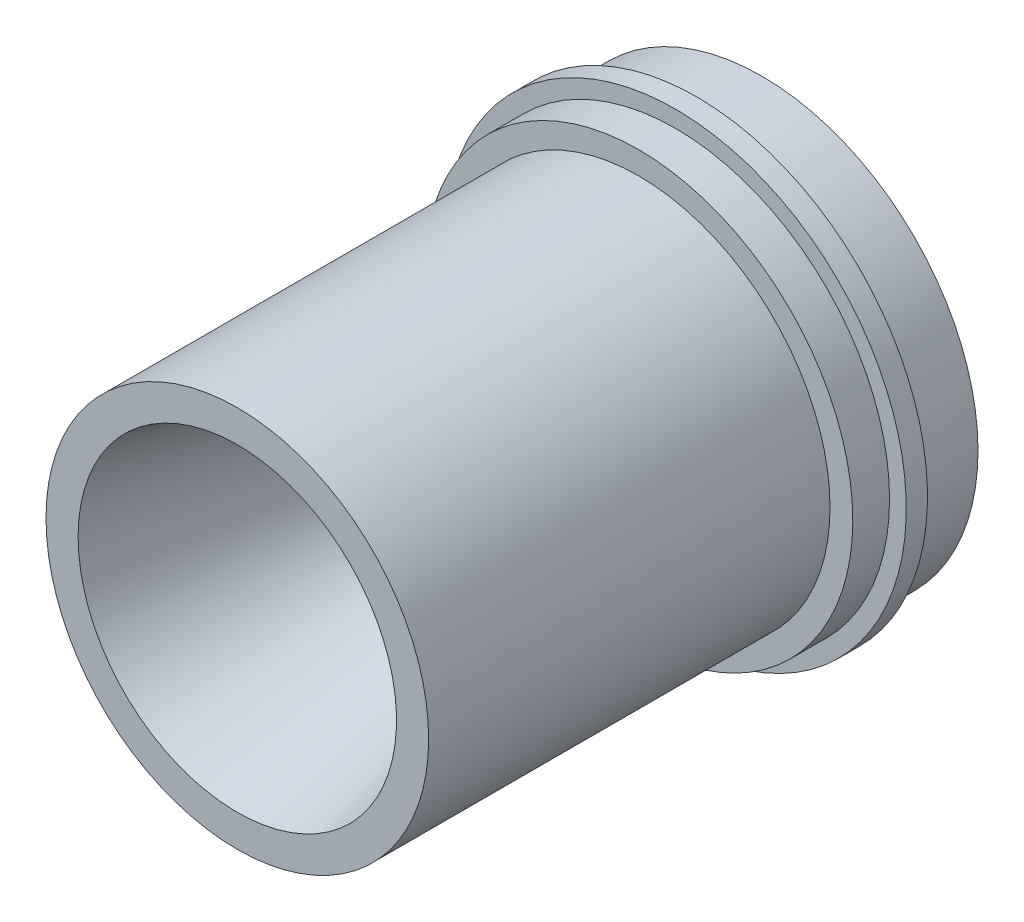
ISO-10303-21;
HEADER;
FILE_DESCRIPTION(('STEP AP214'),'2;1');
FILE_NAME('part.step','',(''),(''),'','','');
FILE_SCHEMA(('AUTOMOTIVE_DESIGN { 1 0 10303 214 1 1 1 1 }'));
ENDSEC;
DATA;
#1=APPLICATION_CONTEXT('core data for automotive mechanical design processes');
#2=APPLICATION_PROTOCOL_DEFINITION('international standard','automotive_design',2000,#1);
#3=PRODUCT_CONTEXT('',#1,'mechanical');
#4=PRODUCT('Part','Part','',(#3));
#5=PRODUCT_RELATED_PRODUCT_CATEGORY('part','',(#4));
#6=PRODUCT_DEFINITION_FORMATION('','',#4);
#7=PRODUCT_DEFINITION_CONTEXT('part definition',#1,'design');
#8=PRODUCT_DEFINITION('design','',#6,#7);
#9=PRODUCT_DEFINITION_SHAPE('','',#8);
#10=(LENGTH_UNIT() NAMED_UNIT(*) SI_UNIT(.MILLI.,.METRE.));
#11=(NAMED_UNIT(*) PLANE_ANGLE_UNIT() SI_UNIT($,.RADIAN.));
#12=(NAMED_UNIT(*) SI_UNIT($,.STERADIAN.) SOLID_ANGLE_UNIT());
#13=UNCERTAINTY_MEASURE_WITH_UNIT(LENGTH_MEASURE(1.E-05),#10,'distance_accuracy_value','');
#14=(GEOMETRIC_REPRESENTATION_CONTEXT(3) GLOBAL_UNCERTAINTY_ASSIGNED_CONTEXT((#13)) GLOBAL_UNIT_ASSIGNED_CONTEXT((#10,
#11,#12)) REPRESENTATION_CONTEXT('',''));
#15=CARTESIAN_POINT('',(0.,0.,0.));
#16=DIRECTION('',(0.,0.,1.));
#17=DIRECTION('',(1.,0.,0.));
#18=AXIS2_PLACEMENT_3D('',#15,#16,#17);
#19=CARTESIAN_POINT('',(9.779,0.,0.));
#20=CARTESIAN_POINT('',(14.4166614893684,0.,-10.527989379748));
#21=CARTESIAN_POINT('',(26.83,0.,-9.72));
#22=B_SPLINE_CURVE_WITH_KNOTS('',2,(#19,#20,#21),.UNSPECIFIED.,.F.,.F.,(3,3),(0.,1.),.UNSPECIFIED.);
#23=CARTESIAN_POINT('',(0.,0.,0.));
#24=DIRECTION('',(0.,0.,-1.));
#25=AXIS1_PLACEMENT('',#23,#24);
#26=SURFACE_OF_REVOLUTION('',#22,#25);
#27=CARTESIAN_POINT('',(0.,0.,-9.72));
#28=DIRECTION('',(0.,0.,-1.));
#29=DIRECTION('',(-1.,0.,0.));
#30=AXIS2_PLACEMENT_3D('',#27,#28,#29);
#31=CIRCLE('',#30,26.83);
#32=CARTESIAN_POINT('',(-26.83,0.,-9.72));
#33=VERTEX_POINT('',#32);
#34=EDGE_CURVE('E97',#33,#33,#31,.T.);
#35=ORIENTED_EDGE('',*,*,#34,.T.);
#36=EDGE_LOOP('',(#35));
#37=FACE_BOUND('',#36,.T.);
#38=CARTESIAN_POINT('',(0.,0.,0.));
#39=DIRECTION('',(0.,0.,-1.));
#40=DIRECTION('',(-1.,0.,0.));
#41=AXIS2_PLACEMENT_3D('',#38,#39,#40);
#42=CIRCLE('',#41,9.779);
#43=CARTESIAN_POINT('',(-9.779,0.,0.));
#44=VERTEX_POINT('',#43);
#45=EDGE_CURVE('E10',#44,#44,#42,.T.);
#46=ORIENTED_EDGE('',*,*,#45,.F.);
#47=EDGE_LOOP('',(#46));
#48=FACE_BOUND('',#47,.T.);
#49=ADVANCED_FACE('F45',(#37,#48),#26,.F.);
#50=CARTESIAN_POINT('',(0.,0.,0.));
#51=DIRECTION('',(0.,0.,-1.));
#52=DIRECTION('',(-1.,0.,0.));
#53=AXIS2_PLACEMENT_3D('',#50,#51,#52);
#54=CYLINDRICAL_SURFACE('',#53,9.779);
#55=ORIENTED_EDGE('',*,*,#45,.T.);
#56=EDGE_LOOP('',(#55));
#57=FACE_BOUND('',#56,.T.);
#58=CARTESIAN_POINT('',(0.,0.,13.6226));
#59=DIRECTION('',(0.,0.,-1.));
#60=DIRECTION('',(-1.,0.,0.));
#61=AXIS2_PLACEMENT_3D('',#58,#59,#60);
#62=CIRCLE('',#61,9.779);
#63=CARTESIAN_POINT('',(-9.779,0.,13.6226));
#64=VERTEX_POINT('',#63);
#65=EDGE_CURVE('E53',#64,#64,#62,.T.);
#66=ORIENTED_EDGE('',*,*,#65,.F.);
#67=EDGE_LOOP('',(#66));
#68=FACE_BOUND('',#67,.T.);
#69=ADVANCED_FACE('F140',(#57,#68),#54,.F.);
#70=CARTESIAN_POINT('',(0.,0.,13.6226));
#71=DIRECTION('',(0.,0.,1.));
#72=DIRECTION('',(1.,0.,0.));
#73=AXIS2_PLACEMENT_3D('',#70,#71,#72);
#74=CONICAL_SURFACE('',#73,9.779,0.249402799409452);
#75=CARTESIAN_POINT('',(0.,0.,68.670406433824));
#76=DIRECTION('',(0.,0.,-1.));
#77=DIRECTION('',(-1.,0.,0.));
#78=AXIS2_PLACEMENT_3D('',#75,#76,#77);
#79=CIRCLE('',#78,23.8);
#80=CARTESIAN_POINT('',(-23.8,0.,68.670406433824));
#81=VERTEX_POINT('',#80);
#82=EDGE_CURVE('E58',#81,#81,#79,.T.);
#83=ORIENTED_EDGE('',*,*,#82,.F.);
#84=EDGE_LOOP('',(#83));
#85=FACE_BOUND('',#84,.T.);
#86=ORIENTED_EDGE('',*,*,#65,.T.);
#87=EDGE_LOOP('',(#86));
#88=FACE_BOUND('',#87,.T.);
#89=ADVANCED_FACE('F144',(#85,#88),#74,.F.);
#90=CARTESIAN_POINT('',(0.,0.,68.670406433824));
#91=DIRECTION('',(0.,0.,1.));
#92=DIRECTION('',(1.,0.,0.));
#93=AXIS2_PLACEMENT_3D('',#90,#91,#92);
#94=PLANE('',#93);
#95=ORIENTED_EDGE('',*,*,#82,.T.);
#96=EDGE_LOOP('',(#95));
#97=FACE_BOUND('',#96,.T.);
#98=CARTESIAN_POINT('',(0.,0.,68.670406433824));
#99=DIRECTION('',(0.,0.,-1.));
#100=DIRECTION('',(-1.,0.,0.));
#101=AXIS2_PLACEMENT_3D('',#98,#99,#100);
#102=CIRCLE('',#101,28.6);
#103=CARTESIAN_POINT('',(-28.6,0.,68.670406433824));
#104=VERTEX_POINT('',#103);
#105=EDGE_CURVE('E63',#104,#104,#102,.T.);
#106=ORIENTED_EDGE('',*,*,#105,.F.);
#107=EDGE_LOOP('',(#106));
#108=FACE_BOUND('',#107,.T.);
#109=ADVANCED_FACE('F148',(#97,#108),#94,.T.);
#110=CARTESIAN_POINT('',(0.,0.,0.));
#111=DIRECTION('',(0.,0.,-1.));
#112=DIRECTION('',(-1.,0.,0.));
#113=AXIS2_PLACEMENT_3D('',#110,#111,#112);
#114=CYLINDRICAL_SURFACE('',#113,28.6);
#115=ORIENTED_EDGE('',*,*,#105,.T.);
#116=EDGE_LOOP('',(#115));
#117=FACE_BOUND('',#116,.T.);
#118=CARTESIAN_POINT('',(0.,0.,8.67040643382401));
#119=DIRECTION('',(0.,0.,-1.));
#120=DIRECTION('',(-1.,0.,0.));
#121=AXIS2_PLACEMENT_3D('',#118,#119,#120);
#122=CIRCLE('',#121,28.6);
#123=CARTESIAN_POINT('',(-28.6,0.,8.67040643382401));
#124=VERTEX_POINT('',#123);
#125=EDGE_CURVE('E69',#124,#124,#122,.T.);
#126=ORIENTED_EDGE('',*,*,#125,.F.);
#127=EDGE_LOOP('',(#126));
#128=FACE_BOUND('',#127,.T.);
#129=ADVANCED_FACE('F155',(#117,#128),#114,.T.);
#130=CARTESIAN_POINT('',(0.,0.,8.67040643382401));
#131=DIRECTION('',(0.,0.,1.));
#132=DIRECTION('',(1.,0.,0.));
#133=AXIS2_PLACEMENT_3D('',#130,#131,#132);
#134=PLANE('',#133);
#135=ORIENTED_EDGE('',*,*,#125,.T.);
#136=EDGE_LOOP('',(#135));
#137=FACE_BOUND('',#136,.T.);
#138=CARTESIAN_POINT('',(0.,0.,8.67040643382401));
#139=DIRECTION('',(0.,0.,-1.));
#140=DIRECTION('',(-1.,0.,0.));
#141=AXIS2_PLACEMENT_3D('',#138,#139,#140);
#142=CIRCLE('',#141,32.);
#143=CARTESIAN_POINT('',(-32.,0.,8.67040643382401));
#144=VERTEX_POINT('',#143);
#145=EDGE_CURVE('E73',#144,#144,#142,.T.);
#146=ORIENTED_EDGE('',*,*,#145,.F.);
#147=EDGE_LOOP('',(#146));
#148=FACE_BOUND('',#147,.T.);
#149=ADVANCED_FACE('F159',(#137,#148),#134,.T.);
#150=CARTESIAN_POINT('',(0.,0.,0.));
#151=DIRECTION('',(0.,0.,-1.));
#152=DIRECTION('',(-1.,0.,0.));
#153=AXIS2_PLACEMENT_3D('',#150,#151,#152);
#154=CYLINDRICAL_SURFACE('',#153,32.);
#155=ORIENTED_EDGE('',*,*,#145,.T.);
#156=EDGE_LOOP('',(#155));
#157=FACE_BOUND('',#156,.T.);
#158=CARTESIAN_POINT('',(0.,0.,3.17040643382401));
#159=DIRECTION('',(0.,0.,-1.));
#160=DIRECTION('',(-1.,0.,0.));
#161=AXIS2_PLACEMENT_3D('',#158,#159,#160);
#162=CIRCLE('',#161,32.);
#163=CARTESIAN_POINT('',(-32.,0.,3.17040643382401));
#164=VERTEX_POINT('',#163);
#165=EDGE_CURVE('E77',#164,#164,#162,.T.);
#166=ORIENTED_EDGE('',*,*,#165,.F.);
#167=EDGE_LOOP('',(#166));
#168=FACE_BOUND('',#167,.T.);
#169=ADVANCED_FACE('F136',(#157,#168),#154,.T.);
#170=CARTESIAN_POINT('',(0.,0.,3.17040643382401));
#171=DIRECTION('',(0.,0.,1.));
#172=DIRECTION('',(1.,0.,0.));
#173=AXIS2_PLACEMENT_3D('',#170,#171,#172);
#174=PLANE('',#173);
#175=ORIENTED_EDGE('',*,*,#165,.T.);
#176=EDGE_LOOP('',(#175));
#177=FACE_BOUND('',#176,.T.);
#178=CARTESIAN_POINT('',(0.,0.,3.17040643382401));
#179=DIRECTION('',(0.,0.,-1.));
#180=DIRECTION('',(-1.,0.,0.));
#181=AXIS2_PLACEMENT_3D('',#178,#179,#180);
#182=CIRCLE('',#181,34.5);
#183=CARTESIAN_POINT('',(-34.5,0.,3.17040643382401));
#184=VERTEX_POINT('',#183);
#185=EDGE_CURVE('E81',#184,#184,#182,.T.);
#186=ORIENTED_EDGE('',*,*,#185,.F.);
#187=EDGE_LOOP('',(#186));
#188=FACE_BOUND('',#187,.T.);
#189=ADVANCED_FACE('F130',(#177,#188),#174,.T.);
#190=CARTESIAN_POINT('',(0.,0.,0.));
#191=DIRECTION('',(0.,0.,-1.));
#192=DIRECTION('',(-1.,0.,0.));
#193=AXIS2_PLACEMENT_3D('',#190,#191,#192);
#194=CYLINDRICAL_SURFACE('',#193,34.5);
#195=ORIENTED_EDGE('',*,*,#185,.T.);
#196=EDGE_LOOP('',(#195));
#197=FACE_BOUND('',#196,.T.);
#198=CARTESIAN_POINT('',(0.,0.,0.));
#199=DIRECTION('',(0.,0.,-1.));
#200=DIRECTION('',(-1.,0.,0.));
#201=AXIS2_PLACEMENT_3D('',#198,#199,#200);
#202=CIRCLE('',#201,34.5);
#203=CARTESIAN_POINT('',(-34.5,0.,0.));
#204=VERTEX_POINT('',#203);
#205=EDGE_CURVE('E85',#204,#204,#202,.T.);
#206=ORIENTED_EDGE('',*,*,#205,.F.);
#207=EDGE_LOOP('',(#206));
#208=FACE_BOUND('',#207,.T.);
#209=ADVANCED_FACE('F125',(#197,#208),#194,.T.);
#210=CARTESIAN_POINT('',(0.,0.,0.));
#211=DIRECTION('',(0.,0.,1.));
#212=DIRECTION('',(1.,0.,0.));
#213=AXIS2_PLACEMENT_3D('',#210,#211,#212);
#214=PLANE('',#213);
#215=CARTESIAN_POINT('',(0.,0.,0.));
#216=DIRECTION('',(0.,0.,-1.));
#217=DIRECTION('',(-1.,0.,0.));
#218=AXIS2_PLACEMENT_3D('',#215,#216,#217);
#219=CIRCLE('',#218,32.33);
#220=CARTESIAN_POINT('',(-32.33,0.,0.));
#221=VERTEX_POINT('',#220);
#222=EDGE_CURVE('E89',#221,#221,#219,.T.);
#223=ORIENTED_EDGE('',*,*,#222,.F.);
#224=EDGE_LOOP('',(#223));
#225=FACE_BOUND('',#224,.T.);
#226=ORIENTED_EDGE('',*,*,#205,.T.);
#227=EDGE_LOOP('',(#226));
#228=FACE_BOUND('',#227,.T.);
#229=ADVANCED_FACE('F119',(#225,#228),#214,.F.);
#230=CARTESIAN_POINT('',(0.,0.,0.));
#231=DIRECTION('',(0.,0.,-1.));
#232=DIRECTION('',(-1.,0.,0.));
#233=AXIS2_PLACEMENT_3D('',#230,#231,#232);
#234=CYLINDRICAL_SURFACE('',#233,32.33);
#235=CARTESIAN_POINT('',(0.,0.,-9.72));
#236=DIRECTION('',(0.,0.,-1.));
#237=DIRECTION('',(-1.,0.,0.));
#238=AXIS2_PLACEMENT_3D('',#235,#236,#237);
#239=CIRCLE('',#238,32.33);
#240=CARTESIAN_POINT('',(-32.33,0.,-9.72));
#241=VERTEX_POINT('',#240);
#242=EDGE_CURVE('E93',#241,#241,#239,.T.);
#243=ORIENTED_EDGE('',*,*,#242,.F.);
#244=EDGE_LOOP('',(#243));
#245=FACE_BOUND('',#244,.T.);
#246=ORIENTED_EDGE('',*,*,#222,.T.);
#247=EDGE_LOOP('',(#246));
#248=FACE_BOUND('',#247,.T.);
#249=ADVANCED_FACE('F113',(#245,#248),#234,.T.);
#250=CARTESIAN_POINT('',(0.,0.,-9.72));
#251=DIRECTION('',(0.,0.,1.));
#252=DIRECTION('',(1.,0.,0.));
#253=AXIS2_PLACEMENT_3D('',#250,#251,#252);
#254=PLANE('',#253);
#255=ORIENTED_EDGE('',*,*,#34,.F.);
#256=EDGE_LOOP('',(#255));
#257=FACE_BOUND('',#256,.T.);
#258=ORIENTED_EDGE('',*,*,#242,.T.);
#259=EDGE_LOOP('',(#258));
#260=FACE_BOUND('',#259,.T.);
#261=ADVANCED_FACE('F110',(#257,#260),#254,.F.);
#262=CLOSED_SHELL('',(#49,#69,#89,#109,#129,#149,#169,#189,#209,#229,#249,#261));
#263=MANIFOLD_SOLID_BREP('B2',#262);
#264=ADVANCED_BREP_SHAPE_REPRESENTATION('',(#18,#263),#14);
#265=SHAPE_DEFINITION_REPRESENTATION(#9,#264);
ENDSEC;
END-ISO-10303-21;
